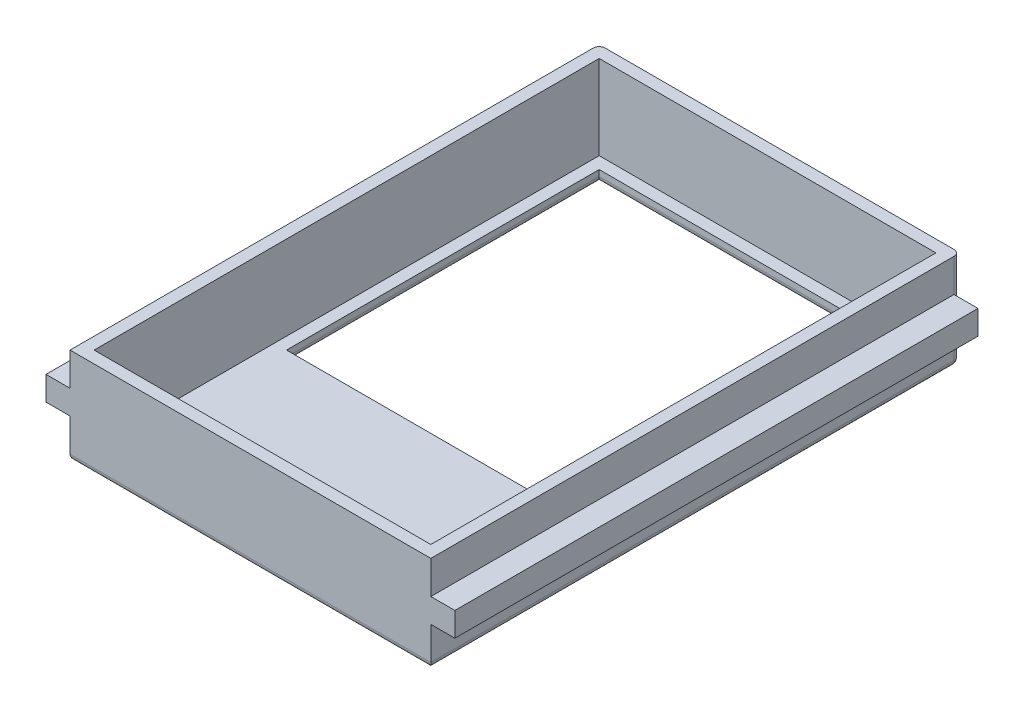
ISO-10303-21;
HEADER;
FILE_DESCRIPTION(('STEP AP214'),'2;1');
FILE_NAME('part.step','',(''),(''),'','','');
FILE_SCHEMA(('AUTOMOTIVE_DESIGN { 1 0 10303 214 1 1 1 1 }'));
ENDSEC;
DATA;
#1=APPLICATION_CONTEXT('core data for automotive mechanical design processes');
#2=APPLICATION_PROTOCOL_DEFINITION('international standard','automotive_design',2000,#1);
#3=PRODUCT_CONTEXT('',#1,'mechanical');
#4=PRODUCT('Part','Part','',(#3));
#5=PRODUCT_RELATED_PRODUCT_CATEGORY('part','',(#4));
#6=PRODUCT_DEFINITION_FORMATION('','',#4);
#7=PRODUCT_DEFINITION_CONTEXT('part definition',#1,'design');
#8=PRODUCT_DEFINITION('design','',#6,#7);
#9=PRODUCT_DEFINITION_SHAPE('','',#8);
#10=(LENGTH_UNIT() NAMED_UNIT(*) SI_UNIT(.MILLI.,.METRE.));
#11=(NAMED_UNIT(*) PLANE_ANGLE_UNIT() SI_UNIT($,.RADIAN.));
#12=(NAMED_UNIT(*) SI_UNIT($,.STERADIAN.) SOLID_ANGLE_UNIT());
#13=UNCERTAINTY_MEASURE_WITH_UNIT(LENGTH_MEASURE(1.E-05),#10,'distance_accuracy_value','');
#14=(GEOMETRIC_REPRESENTATION_CONTEXT(3) GLOBAL_UNCERTAINTY_ASSIGNED_CONTEXT((#13)) GLOBAL_UNIT_ASSIGNED_CONTEXT((#10,
#11,#12)) REPRESENTATION_CONTEXT('',''));
#15=CARTESIAN_POINT('',(0.,0.,0.));
#16=DIRECTION('',(0.,0.,1.));
#17=DIRECTION('',(1.,0.,0.));
#18=AXIS2_PLACEMENT_3D('',#15,#16,#17);
#19=CARTESIAN_POINT('',(30.,1.,0.));
#20=DIRECTION('',(-1.,0.,0.));
#21=DIRECTION('',(0.,0.,1.));
#22=AXIS2_PLACEMENT_3D('',#19,#20,#21);
#23=PLANE('',#22);
#24=DIRECTION('',(0.,0.,-1.));
#25=VECTOR('',#24,1.);
#26=CARTESIAN_POINT('',(30.,3.25,0.));
#27=LINE('',#26,#25);
#28=CARTESIAN_POINT('',(30.,3.25,0.));
#29=VERTEX_POINT('',#28);
#30=CARTESIAN_POINT('',(30.,3.25,-43.5));
#31=VERTEX_POINT('',#30);
#32=EDGE_CURVE('E58',#29,#31,#27,.T.);
#33=ORIENTED_EDGE('',*,*,#32,.F.);
#34=DIRECTION('',(0.,-1.,0.));
#35=VECTOR('',#34,1.);
#36=CARTESIAN_POINT('',(30.,1.,0.));
#37=LINE('',#36,#35);
#38=CARTESIAN_POINT('',(30.,0.5,0.));
#39=VERTEX_POINT('',#38);
#40=EDGE_CURVE('E241',#29,#39,#37,.T.);
#41=ORIENTED_EDGE('',*,*,#40,.T.);
#42=DIRECTION('',(0.,0.,-1.));
#43=VECTOR('',#42,1.);
#44=CARTESIAN_POINT('',(30.,0.5,-44.));
#45=LINE('',#44,#43);
#46=CARTESIAN_POINT('',(30.,0.5,-43.5));
#47=VERTEX_POINT('',#46);
#48=EDGE_CURVE('E376',#39,#47,#45,.T.);
#49=ORIENTED_EDGE('',*,*,#48,.T.);
#50=DIRECTION('',(0.,-1.,0.));
#51=VECTOR('',#50,1.);
#52=CARTESIAN_POINT('',(30.,1.,-43.5));
#53=LINE('',#52,#51);
#54=EDGE_CURVE('E374',#47,#31,#53,.F.);
#55=ORIENTED_EDGE('',*,*,#54,.T.);
#56=EDGE_LOOP('',(#33,#41,#49,#55));
#57=FACE_BOUND('',#56,.T.);
#58=ADVANCED_FACE('F41',(#57),#23,.F.);
#59=DIRECTION('',(0.,0.,1.));
#60=VECTOR('',#59,1.);
#61=CARTESIAN_POINT('',(30.,5.25,0.));
#62=LINE('',#61,#60);
#63=CARTESIAN_POINT('',(30.,5.25,-43.5));
#64=VERTEX_POINT('',#63);
#65=CARTESIAN_POINT('',(30.,5.25,0.));
#66=VERTEX_POINT('',#65);
#67=EDGE_CURVE('E236',#64,#66,#62,.T.);
#68=ORIENTED_EDGE('',*,*,#67,.F.);
#69=CARTESIAN_POINT('',(30.,8.,-43.5));
#70=VERTEX_POINT('',#69);
#71=EDGE_CURVE('E373',#64,#70,#53,.F.);
#72=ORIENTED_EDGE('',*,*,#71,.T.);
#73=DIRECTION('',(0.,0.,-1.));
#74=VECTOR('',#73,1.);
#75=CARTESIAN_POINT('',(30.,8.,-44.));
#76=LINE('',#75,#74);
#77=CARTESIAN_POINT('',(30.,8.,0.));
#78=VERTEX_POINT('',#77);
#79=EDGE_CURVE('E314',#78,#70,#76,.T.);
#80=ORIENTED_EDGE('',*,*,#79,.F.);
#81=EDGE_CURVE('E66',#78,#66,#37,.T.);
#82=ORIENTED_EDGE('',*,*,#81,.T.);
#83=EDGE_LOOP('',(#68,#72,#80,#82));
#84=FACE_BOUND('',#83,.T.);
#85=ADVANCED_FACE('F485',(#84),#23,.F.);
#86=CARTESIAN_POINT('',(0.,1.,0.));
#87=DIRECTION('',(1.,0.,0.));
#88=DIRECTION('',(0.,0.,-1.));
#89=AXIS2_PLACEMENT_3D('',#86,#87,#88);
#90=PLANE('',#89);
#91=DIRECTION('',(0.,0.,1.));
#92=VECTOR('',#91,1.);
#93=CARTESIAN_POINT('',(0.,3.25,-43.5));
#94=LINE('',#93,#92);
#95=CARTESIAN_POINT('',(0.,3.25,-43.5));
#96=VERTEX_POINT('',#95);
#97=CARTESIAN_POINT('',(0.,3.25,0.));
#98=VERTEX_POINT('',#97);
#99=EDGE_CURVE('E245',#96,#98,#94,.T.);
#100=ORIENTED_EDGE('',*,*,#99,.F.);
#101=DIRECTION('',(0.,-1.,0.));
#102=VECTOR('',#101,1.);
#103=CARTESIAN_POINT('',(0.,1.,-43.5));
#104=LINE('',#103,#102);
#105=CARTESIAN_POINT('',(0.,0.5,-43.5));
#106=VERTEX_POINT('',#105);
#107=EDGE_CURVE('E384',#96,#106,#104,.T.);
#108=ORIENTED_EDGE('',*,*,#107,.T.);
#109=DIRECTION('',(0.,0.,1.));
#110=VECTOR('',#109,1.);
#111=CARTESIAN_POINT('',(0.,0.5,0.));
#112=LINE('',#111,#110);
#113=CARTESIAN_POINT('',(0.,0.5,0.));
#114=VERTEX_POINT('',#113);
#115=EDGE_CURVE('E388',#106,#114,#112,.T.);
#116=ORIENTED_EDGE('',*,*,#115,.T.);
#117=DIRECTION('',(0.,-1.,0.));
#118=VECTOR('',#117,1.);
#119=CARTESIAN_POINT('',(0.,1.,0.));
#120=LINE('',#119,#118);
#121=EDGE_CURVE('E341',#98,#114,#120,.T.);
#122=ORIENTED_EDGE('',*,*,#121,.F.);
#123=EDGE_LOOP('',(#100,#108,#116,#122));
#124=FACE_BOUND('',#123,.T.);
#125=ADVANCED_FACE('F435',(#124),#90,.F.);
#126=DIRECTION('',(0.,0.,-1.));
#127=VECTOR('',#126,1.);
#128=CARTESIAN_POINT('',(0.,5.25,-43.5));
#129=LINE('',#128,#127);
#130=CARTESIAN_POINT('',(0.,5.25,0.));
#131=VERTEX_POINT('',#130);
#132=CARTESIAN_POINT('',(0.,5.25,-43.5));
#133=VERTEX_POINT('',#132);
#134=EDGE_CURVE('E255',#131,#133,#129,.T.);
#135=ORIENTED_EDGE('',*,*,#134,.F.);
#136=CARTESIAN_POINT('',(0.,8.,0.));
#137=VERTEX_POINT('',#136);
#138=EDGE_CURVE('E342',#137,#131,#120,.T.);
#139=ORIENTED_EDGE('',*,*,#138,.F.);
#140=DIRECTION('',(0.,0.,1.));
#141=VECTOR('',#140,1.);
#142=CARTESIAN_POINT('',(0.,8.,-44.));
#143=LINE('',#142,#141);
#144=CARTESIAN_POINT('',(0.,8.,-43.5));
#145=VERTEX_POINT('',#144);
#146=EDGE_CURVE('E309',#145,#137,#143,.T.);
#147=ORIENTED_EDGE('',*,*,#146,.F.);
#148=EDGE_CURVE('E385',#145,#133,#104,.T.);
#149=ORIENTED_EDGE('',*,*,#148,.T.);
#150=EDGE_LOOP('',(#135,#139,#147,#149));
#151=FACE_BOUND('',#150,.T.);
#152=ADVANCED_FACE('F479',(#151),#90,.F.);
#153=CARTESIAN_POINT('',(0.,1.,0.));
#154=DIRECTION('',(0.,0.,-1.));
#155=DIRECTION('',(-1.,0.,0.));
#156=AXIS2_PLACEMENT_3D('',#153,#154,#155);
#157=PLANE('',#156);
#158=ORIENTED_EDGE('',*,*,#138,.T.);
#159=DIRECTION('',(1.,0.,0.));
#160=VECTOR('',#159,1.);
#161=CARTESIAN_POINT('',(-2.,5.25,0.));
#162=LINE('',#161,#160);
#163=CARTESIAN_POINT('',(-2.,5.25,0.));
#164=VERTEX_POINT('',#163);
#165=EDGE_CURVE('E268',#164,#131,#162,.T.);
#166=ORIENTED_EDGE('',*,*,#165,.F.);
#167=DIRECTION('',(0.,1.,0.));
#168=VECTOR('',#167,1.);
#169=CARTESIAN_POINT('',(-2.,3.25,0.));
#170=LINE('',#169,#168);
#171=CARTESIAN_POINT('',(-2.,3.25,0.));
#172=VERTEX_POINT('',#171);
#173=EDGE_CURVE('E257',#172,#164,#170,.T.);
#174=ORIENTED_EDGE('',*,*,#173,.F.);
#175=DIRECTION('',(1.,0.,0.));
#176=VECTOR('',#175,1.);
#177=CARTESIAN_POINT('',(-2.,3.25,0.));
#178=LINE('',#177,#176);
#179=EDGE_CURVE('E271',#172,#98,#178,.T.);
#180=ORIENTED_EDGE('',*,*,#179,.T.);
#181=ORIENTED_EDGE('',*,*,#121,.T.);
#182=DIRECTION('',(1.,0.,0.));
#183=VECTOR('',#182,1.);
#184=CARTESIAN_POINT('',(30.,0.5,0.));
#185=LINE('',#184,#183);
#186=EDGE_CURVE('E371',#114,#39,#185,.T.);
#187=ORIENTED_EDGE('',*,*,#186,.T.);
#188=ORIENTED_EDGE('',*,*,#40,.F.);
#189=DIRECTION('',(-1.,0.,0.));
#190=VECTOR('',#189,1.);
#191=CARTESIAN_POINT('',(32.,3.25,0.));
#192=LINE('',#191,#190);
#193=CARTESIAN_POINT('',(32.,3.25,0.));
#194=VERTEX_POINT('',#193);
#195=EDGE_CURVE('E221',#194,#29,#192,.T.);
#196=ORIENTED_EDGE('',*,*,#195,.F.);
#197=DIRECTION('',(0.,-1.,0.));
#198=VECTOR('',#197,1.);
#199=CARTESIAN_POINT('',(32.,5.25,0.));
#200=LINE('',#199,#198);
#201=CARTESIAN_POINT('',(32.,5.25,0.));
#202=VERTEX_POINT('',#201);
#203=EDGE_CURVE('E227',#202,#194,#200,.T.);
#204=ORIENTED_EDGE('',*,*,#203,.F.);
#205=DIRECTION('',(-1.,0.,0.));
#206=VECTOR('',#205,1.);
#207=CARTESIAN_POINT('',(32.,5.25,0.));
#208=LINE('',#207,#206);
#209=EDGE_CURVE('E496',#202,#66,#208,.T.);
#210=ORIENTED_EDGE('',*,*,#209,.T.);
#211=ORIENTED_EDGE('',*,*,#81,.F.);
#212=DIRECTION('',(1.,0.,0.));
#213=VECTOR('',#212,1.);
#214=CARTESIAN_POINT('',(0.,8.,0.));
#215=LINE('',#214,#213);
#216=EDGE_CURVE('E311',#137,#78,#215,.T.);
#217=ORIENTED_EDGE('',*,*,#216,.F.);
#218=EDGE_LOOP('',(#158,#166,#174,#180,#181,#187,#188,#196,#204,#210,#211,#217));
#219=FACE_BOUND('',#218,.T.);
#220=ADVANCED_FACE('F239',(#219),#157,.F.);
#221=CARTESIAN_POINT('',(0.,1.,-44.));
#222=DIRECTION('',(0.,0.,1.));
#223=DIRECTION('',(1.,0.,0.));
#224=AXIS2_PLACEMENT_3D('',#221,#222,#223);
#225=PLANE('',#224);
#226=DIRECTION('',(-1.,0.,0.));
#227=VECTOR('',#226,1.);
#228=CARTESIAN_POINT('',(0.,8.,-44.));
#229=LINE('',#228,#227);
#230=CARTESIAN_POINT('',(29.5,8.,-44.));
#231=VERTEX_POINT('',#230);
#232=CARTESIAN_POINT('',(0.5,8.,-44.));
#233=VERTEX_POINT('',#232);
#234=EDGE_CURVE('E317',#231,#233,#229,.T.);
#235=ORIENTED_EDGE('',*,*,#234,.F.);
#236=DIRECTION('',(0.,-1.,0.));
#237=VECTOR('',#236,1.);
#238=CARTESIAN_POINT('',(29.5,1.,-44.));
#239=LINE('',#238,#237);
#240=CARTESIAN_POINT('',(29.5,0.5,-44.));
#241=VERTEX_POINT('',#240);
#242=EDGE_CURVE('E382',#231,#241,#239,.T.);
#243=ORIENTED_EDGE('',*,*,#242,.T.);
#244=DIRECTION('',(-1.,0.,0.));
#245=VECTOR('',#244,1.);
#246=CARTESIAN_POINT('',(0.,0.5,-44.));
#247=LINE('',#246,#245);
#248=CARTESIAN_POINT('',(0.5,0.5,-44.));
#249=VERTEX_POINT('',#248);
#250=EDGE_CURVE('E380',#241,#249,#247,.T.);
#251=ORIENTED_EDGE('',*,*,#250,.T.);
#252=DIRECTION('',(0.,-1.,0.));
#253=VECTOR('',#252,1.);
#254=CARTESIAN_POINT('',(0.5,1.,-44.));
#255=LINE('',#254,#253);
#256=EDGE_CURVE('E378',#249,#233,#255,.F.);
#257=ORIENTED_EDGE('',*,*,#256,.T.);
#258=EDGE_LOOP('',(#235,#243,#251,#257));
#259=FACE_BOUND('',#258,.T.);
#260=ADVANCED_FACE('F442',(#259),#225,.F.);
#261=CARTESIAN_POINT('',(0.,1.,0.));
#262=DIRECTION('',(0.,-1.,0.));
#263=DIRECTION('',(0.,0.,-1.));
#264=AXIS2_PLACEMENT_3D('',#261,#262,#263);
#265=PLANE('',#264);
#266=DIRECTION('',(-1.,0.,0.));
#267=VECTOR('',#266,1.);
#268=CARTESIAN_POINT('',(1.,1.,-43.));
#269=LINE('',#268,#267);
#270=CARTESIAN_POINT('',(29.,1.,-43.));
#271=VERTEX_POINT('',#270);
#272=CARTESIAN_POINT('',(1.,1.,-43.));
#273=VERTEX_POINT('',#272);
#274=EDGE_CURVE('E281',#271,#273,#269,.T.);
#275=ORIENTED_EDGE('',*,*,#274,.T.);
#276=DIRECTION('',(0.,0.,1.));
#277=VECTOR('',#276,1.);
#278=CARTESIAN_POINT('',(1.,1.,-43.));
#279=LINE('',#278,#277);
#280=CARTESIAN_POINT('',(1.00000000000001,1.,-1.));
#281=VERTEX_POINT('',#280);
#282=EDGE_CURVE('E289',#273,#281,#279,.T.);
#283=ORIENTED_EDGE('',*,*,#282,.T.);
#284=DIRECTION('',(1.,0.,0.));
#285=VECTOR('',#284,1.);
#286=CARTESIAN_POINT('',(1.00000000000001,1.,-1.));
#287=LINE('',#286,#285);
#288=CARTESIAN_POINT('',(29.,1.,-1.));
#289=VERTEX_POINT('',#288);
#290=EDGE_CURVE('E292',#281,#289,#287,.T.);
#291=ORIENTED_EDGE('',*,*,#290,.T.);
#292=DIRECTION('',(0.,0.,-1.));
#293=VECTOR('',#292,1.);
#294=CARTESIAN_POINT('',(29.,1.,-43.));
#295=LINE('',#294,#293);
#296=EDGE_CURVE('E296',#289,#271,#295,.T.);
#297=ORIENTED_EDGE('',*,*,#296,.T.);
#298=EDGE_LOOP('',(#275,#283,#291,#297));
#299=FACE_BOUND('',#298,.T.);
#300=DIRECTION('',(1.,0.,0.));
#301=VECTOR('',#300,1.);
#302=CARTESIAN_POINT('',(2.,1.,-16.));
#303=LINE('',#302,#301);
#304=CARTESIAN_POINT('',(2.,1.,-16.));
#305=VERTEX_POINT('',#304);
#306=CARTESIAN_POINT('',(28.,1.,-16.));
#307=VERTEX_POINT('',#306);
#308=EDGE_CURVE('E323',#305,#307,#303,.T.);
#309=ORIENTED_EDGE('',*,*,#308,.F.);
#310=DIRECTION('',(0.,0.,1.));
#311=VECTOR('',#310,1.);
#312=CARTESIAN_POINT('',(2.,1.,-42.));
#313=LINE('',#312,#311);
#314=CARTESIAN_POINT('',(2.,1.,-42.));
#315=VERTEX_POINT('',#314);
#316=EDGE_CURVE('E320',#315,#305,#313,.T.);
#317=ORIENTED_EDGE('',*,*,#316,.F.);
#318=DIRECTION('',(-1.,0.,0.));
#319=VECTOR('',#318,1.);
#320=CARTESIAN_POINT('',(2.,1.,-42.));
#321=LINE('',#320,#319);
#322=CARTESIAN_POINT('',(28.,1.,-42.));
#323=VERTEX_POINT('',#322);
#324=EDGE_CURVE('E329',#323,#315,#321,.T.);
#325=ORIENTED_EDGE('',*,*,#324,.F.);
#326=DIRECTION('',(0.,0.,-1.));
#327=VECTOR('',#326,1.);
#328=CARTESIAN_POINT('',(28.,1.,-42.));
#329=LINE('',#328,#327);
#330=EDGE_CURVE('E326',#307,#323,#329,.T.);
#331=ORIENTED_EDGE('',*,*,#330,.F.);
#332=EDGE_LOOP('',(#309,#317,#325,#331));
#333=FACE_BOUND('',#332,.T.);
#334=ADVANCED_FACE('F651',(#299,#333),#265,.F.);
#335=CARTESIAN_POINT('',(0.,0.,0.));
#336=DIRECTION('',(0.,-1.,0.));
#337=DIRECTION('',(0.,0.,-1.));
#338=AXIS2_PLACEMENT_3D('',#335,#336,#337);
#339=PLANE('',#338);
#340=DIRECTION('',(0.,0.,-1.));
#341=VECTOR('',#340,1.);
#342=CARTESIAN_POINT('',(28.5,0.,-42.));
#343=LINE('',#342,#341);
#344=CARTESIAN_POINT('',(28.5,0.,-15.5));
#345=VERTEX_POINT('',#344);
#346=CARTESIAN_POINT('',(28.5,0.,-42.5));
#347=VERTEX_POINT('',#346);
#348=EDGE_CURVE('E357',#345,#347,#343,.T.);
#349=ORIENTED_EDGE('',*,*,#348,.T.);
#350=DIRECTION('',(-1.,0.,0.));
#351=VECTOR('',#350,1.);
#352=CARTESIAN_POINT('',(2.,0.,-42.5));
#353=LINE('',#352,#351);
#354=CARTESIAN_POINT('',(1.5,0.,-42.5));
#355=VERTEX_POINT('',#354);
#356=EDGE_CURVE('E359',#347,#355,#353,.T.);
#357=ORIENTED_EDGE('',*,*,#356,.T.);
#358=DIRECTION('',(0.,0.,1.));
#359=VECTOR('',#358,1.);
#360=CARTESIAN_POINT('',(1.5,0.,-16.));
#361=LINE('',#360,#359);
#362=CARTESIAN_POINT('',(1.5,0.,-15.5));
#363=VERTEX_POINT('',#362);
#364=EDGE_CURVE('E353',#355,#363,#361,.T.);
#365=ORIENTED_EDGE('',*,*,#364,.T.);
#366=DIRECTION('',(1.,0.,0.));
#367=VECTOR('',#366,1.);
#368=CARTESIAN_POINT('',(28.,0.,-15.5));
#369=LINE('',#368,#367);
#370=EDGE_CURVE('E355',#363,#345,#369,.T.);
#371=ORIENTED_EDGE('',*,*,#370,.T.);
#372=EDGE_LOOP('',(#349,#357,#365,#371));
#373=FACE_BOUND('',#372,.T.);
#374=DIRECTION('',(0.,0.,-1.));
#375=VECTOR('',#374,1.);
#376=CARTESIAN_POINT('',(29.5,0.,0.));
#377=LINE('',#376,#375);
#378=CARTESIAN_POINT('',(29.5,0.,-43.5));
#379=VERTEX_POINT('',#378);
#380=CARTESIAN_POINT('',(29.5,0.,-0.5));
#381=VERTEX_POINT('',#380);
#382=EDGE_CURVE('E348',#379,#381,#377,.F.);
#383=ORIENTED_EDGE('',*,*,#382,.T.);
#384=DIRECTION('',(1.,0.,0.));
#385=VECTOR('',#384,1.);
#386=CARTESIAN_POINT('',(0.,0.,-0.5));
#387=LINE('',#386,#385);
#388=CARTESIAN_POINT('',(0.5,0.,-0.5));
#389=VERTEX_POINT('',#388);
#390=EDGE_CURVE('E350',#381,#389,#387,.F.);
#391=ORIENTED_EDGE('',*,*,#390,.T.);
#392=DIRECTION('',(0.,0.,1.));
#393=VECTOR('',#392,1.);
#394=CARTESIAN_POINT('',(0.5,0.,-44.));
#395=LINE('',#394,#393);
#396=CARTESIAN_POINT('',(0.5,0.,-43.5));
#397=VERTEX_POINT('',#396);
#398=EDGE_CURVE('E344',#389,#397,#395,.F.);
#399=ORIENTED_EDGE('',*,*,#398,.T.);
#400=DIRECTION('',(-1.,0.,0.));
#401=VECTOR('',#400,1.);
#402=CARTESIAN_POINT('',(30.,0.,-43.5));
#403=LINE('',#402,#401);
#404=EDGE_CURVE('E346',#397,#379,#403,.F.);
#405=ORIENTED_EDGE('',*,*,#404,.T.);
#406=EDGE_LOOP('',(#383,#391,#399,#405));
#407=FACE_BOUND('',#406,.T.);
#408=ADVANCED_FACE('F465',(#373,#407),#339,.T.);
#409=CARTESIAN_POINT('',(2.,0.,-42.));
#410=DIRECTION('',(-1.,0.,0.));
#411=DIRECTION('',(0.,0.,1.));
#412=AXIS2_PLACEMENT_3D('',#409,#410,#411);
#413=PLANE('',#412);
#414=DIRECTION('',(0.,1.,0.));
#415=VECTOR('',#414,1.);
#416=CARTESIAN_POINT('',(2.,0.,-16.));
#417=LINE('',#416,#415);
#418=CARTESIAN_POINT('',(2.,0.5,-16.));
#419=VERTEX_POINT('',#418);
#420=EDGE_CURVE('E332',#419,#305,#417,.T.);
#421=ORIENTED_EDGE('',*,*,#420,.F.);
#422=DIRECTION('',(0.,0.,1.));
#423=VECTOR('',#422,1.);
#424=CARTESIAN_POINT('',(2.,0.5,-42.));
#425=LINE('',#424,#423);
#426=CARTESIAN_POINT('',(2.,0.5,-42.));
#427=VERTEX_POINT('',#426);
#428=EDGE_CURVE('E369',#419,#427,#425,.F.);
#429=ORIENTED_EDGE('',*,*,#428,.T.);
#430=DIRECTION('',(0.,1.,0.));
#431=VECTOR('',#430,1.);
#432=CARTESIAN_POINT('',(2.,0.,-42.));
#433=LINE('',#432,#431);
#434=EDGE_CURVE('E333',#427,#315,#433,.T.);
#435=ORIENTED_EDGE('',*,*,#434,.T.);
#436=ORIENTED_EDGE('',*,*,#316,.T.);
#437=EDGE_LOOP('',(#421,#429,#435,#436));
#438=FACE_BOUND('',#437,.T.);
#439=ADVANCED_FACE('F636',(#438),#413,.F.);
#440=CARTESIAN_POINT('',(2.,0.,-42.));
#441=DIRECTION('',(0.,0.,-1.));
#442=DIRECTION('',(-1.,0.,0.));
#443=AXIS2_PLACEMENT_3D('',#440,#441,#442);
#444=PLANE('',#443);
#445=ORIENTED_EDGE('',*,*,#434,.F.);
#446=DIRECTION('',(-1.,0.,0.));
#447=VECTOR('',#446,1.);
#448=CARTESIAN_POINT('',(28.,0.5,-42.));
#449=LINE('',#448,#447);
#450=CARTESIAN_POINT('',(28.,0.5,-42.));
#451=VERTEX_POINT('',#450);
#452=EDGE_CURVE('E362',#427,#451,#449,.F.);
#453=ORIENTED_EDGE('',*,*,#452,.T.);
#454=DIRECTION('',(0.,1.,0.));
#455=VECTOR('',#454,1.);
#456=CARTESIAN_POINT('',(28.,0.,-42.));
#457=LINE('',#456,#455);
#458=EDGE_CURVE('E335',#451,#323,#457,.T.);
#459=ORIENTED_EDGE('',*,*,#458,.T.);
#460=ORIENTED_EDGE('',*,*,#324,.T.);
#461=EDGE_LOOP('',(#445,#453,#459,#460));
#462=FACE_BOUND('',#461,.T.);
#463=ADVANCED_FACE('F628',(#462),#444,.F.);
#464=CARTESIAN_POINT('',(28.,0.,-42.));
#465=DIRECTION('',(1.,0.,0.));
#466=DIRECTION('',(0.,0.,-1.));
#467=AXIS2_PLACEMENT_3D('',#464,#465,#466);
#468=PLANE('',#467);
#469=ORIENTED_EDGE('',*,*,#458,.F.);
#470=DIRECTION('',(0.,0.,-1.));
#471=VECTOR('',#470,1.);
#472=CARTESIAN_POINT('',(28.,0.5,-16.));
#473=LINE('',#472,#471);
#474=CARTESIAN_POINT('',(28.,0.5,-16.));
#475=VERTEX_POINT('',#474);
#476=EDGE_CURVE('E365',#451,#475,#473,.F.);
#477=ORIENTED_EDGE('',*,*,#476,.T.);
#478=DIRECTION('',(0.,1.,0.));
#479=VECTOR('',#478,1.);
#480=CARTESIAN_POINT('',(28.,0.,-16.));
#481=LINE('',#480,#479);
#482=EDGE_CURVE('E337',#475,#307,#481,.T.);
#483=ORIENTED_EDGE('',*,*,#482,.T.);
#484=ORIENTED_EDGE('',*,*,#330,.T.);
#485=EDGE_LOOP('',(#469,#477,#483,#484));
#486=FACE_BOUND('',#485,.T.);
#487=ADVANCED_FACE('F620',(#486),#468,.F.);
#488=CARTESIAN_POINT('',(2.,0.,-16.));
#489=DIRECTION('',(0.,0.,1.));
#490=DIRECTION('',(1.,0.,0.));
#491=AXIS2_PLACEMENT_3D('',#488,#489,#490);
#492=PLANE('',#491);
#493=ORIENTED_EDGE('',*,*,#482,.F.);
#494=DIRECTION('',(1.,0.,0.));
#495=VECTOR('',#494,1.);
#496=CARTESIAN_POINT('',(2.,0.5,-16.));
#497=LINE('',#496,#495);
#498=EDGE_CURVE('E367',#475,#419,#497,.F.);
#499=ORIENTED_EDGE('',*,*,#498,.T.);
#500=ORIENTED_EDGE('',*,*,#420,.T.);
#501=ORIENTED_EDGE('',*,*,#308,.T.);
#502=EDGE_LOOP('',(#493,#499,#500,#501));
#503=FACE_BOUND('',#502,.T.);
#504=ADVANCED_FACE('F613',(#503),#492,.F.);
#505=CARTESIAN_POINT('',(0.,8.,0.));
#506=DIRECTION('',(0.,1.,0.));
#507=DIRECTION('',(0.,0.,1.));
#508=AXIS2_PLACEMENT_3D('',#505,#506,#507);
#509=PLANE('',#508);
#510=ORIENTED_EDGE('',*,*,#79,.T.);
#511=CARTESIAN_POINT('',(29.5,8.,-43.5));
#512=DIRECTION('',(0.,1.,0.));
#513=DIRECTION('',(0.,0.,1.));
#514=AXIS2_PLACEMENT_3D('',#511,#512,#513);
#515=CIRCLE('',#514,0.5);
#516=EDGE_CURVE('E11',#70,#231,#515,.T.);
#517=ORIENTED_EDGE('',*,*,#516,.T.);
#518=ORIENTED_EDGE('',*,*,#234,.T.);
#519=CARTESIAN_POINT('',(0.5,8.,-43.5));
#520=DIRECTION('',(0.,1.,0.));
#521=DIRECTION('',(0.,0.,1.));
#522=AXIS2_PLACEMENT_3D('',#519,#520,#521);
#523=CIRCLE('',#522,0.5);
#524=EDGE_CURVE('E50',#233,#145,#523,.T.);
#525=ORIENTED_EDGE('',*,*,#524,.T.);
#526=ORIENTED_EDGE('',*,*,#146,.T.);
#527=ORIENTED_EDGE('',*,*,#216,.T.);
#528=EDGE_LOOP('',(#510,#517,#518,#525,#526,#527));
#529=FACE_BOUND('',#528,.T.);
#530=DIRECTION('',(1.,0.,0.));
#531=VECTOR('',#530,1.);
#532=CARTESIAN_POINT('',(1.00000000000001,8.,-1.));
#533=LINE('',#532,#531);
#534=CARTESIAN_POINT('',(1.00000000000001,8.,-1.));
#535=VERTEX_POINT('',#534);
#536=CARTESIAN_POINT('',(29.,8.,-1.));
#537=VERTEX_POINT('',#536);
#538=EDGE_CURVE('E280',#535,#537,#533,.T.);
#539=ORIENTED_EDGE('',*,*,#538,.F.);
#540=DIRECTION('',(0.,0.,1.));
#541=VECTOR('',#540,1.);
#542=CARTESIAN_POINT('',(1.,8.,-43.));
#543=LINE('',#542,#541);
#544=CARTESIAN_POINT('',(1.,8.,-43.));
#545=VERTEX_POINT('',#544);
#546=EDGE_CURVE('E278',#545,#535,#543,.T.);
#547=ORIENTED_EDGE('',*,*,#546,.F.);
#548=DIRECTION('',(-1.,0.,0.));
#549=VECTOR('',#548,1.);
#550=CARTESIAN_POINT('',(1.,8.,-43.));
#551=LINE('',#550,#549);
#552=CARTESIAN_POINT('',(29.,8.,-43.));
#553=VERTEX_POINT('',#552);
#554=EDGE_CURVE('E286',#553,#545,#551,.T.);
#555=ORIENTED_EDGE('',*,*,#554,.F.);
#556=DIRECTION('',(0.,0.,-1.));
#557=VECTOR('',#556,1.);
#558=CARTESIAN_POINT('',(29.,8.,-43.));
#559=LINE('',#558,#557);
#560=EDGE_CURVE('E283',#537,#553,#559,.T.);
#561=ORIENTED_EDGE('',*,*,#560,.F.);
#562=EDGE_LOOP('',(#539,#547,#555,#561));
#563=FACE_BOUND('',#562,.T.);
#564=ADVANCED_FACE('F445',(#529,#563),#509,.T.);
#565=CARTESIAN_POINT('',(1.,8.,-43.));
#566=DIRECTION('',(1.,0.,0.));
#567=DIRECTION('',(0.,0.,-1.));
#568=AXIS2_PLACEMENT_3D('',#565,#566,#567);
#569=PLANE('',#568);
#570=ORIENTED_EDGE('',*,*,#282,.F.);
#571=DIRECTION('',(0.,-1.,0.));
#572=VECTOR('',#571,1.);
#573=CARTESIAN_POINT('',(1.,8.,-43.));
#574=LINE('',#573,#572);
#575=EDGE_CURVE('E288',#545,#273,#574,.T.);
#576=ORIENTED_EDGE('',*,*,#575,.F.);
#577=ORIENTED_EDGE('',*,*,#546,.T.);
#578=DIRECTION('',(0.,-1.,0.));
#579=VECTOR('',#578,1.);
#580=CARTESIAN_POINT('',(1.00000000000001,8.,-1.));
#581=LINE('',#580,#579);
#582=EDGE_CURVE('E306',#535,#281,#581,.T.);
#583=ORIENTED_EDGE('',*,*,#582,.T.);
#584=EDGE_LOOP('',(#570,#576,#577,#583));
#585=FACE_BOUND('',#584,.T.);
#586=ADVANCED_FACE('F598',(#585),#569,.T.);
#587=CARTESIAN_POINT('',(1.00000000000001,8.,-1.));
#588=DIRECTION('',(0.,0.,-1.));
#589=DIRECTION('',(-1.,0.,0.));
#590=AXIS2_PLACEMENT_3D('',#587,#588,#589);
#591=PLANE('',#590);
#592=ORIENTED_EDGE('',*,*,#290,.F.);
#593=ORIENTED_EDGE('',*,*,#582,.F.);
#594=ORIENTED_EDGE('',*,*,#538,.T.);
#595=DIRECTION('',(0.,-1.,0.));
#596=VECTOR('',#595,1.);
#597=CARTESIAN_POINT('',(29.,8.,-1.));
#598=LINE('',#597,#596);
#599=EDGE_CURVE('E304',#537,#289,#598,.T.);
#600=ORIENTED_EDGE('',*,*,#599,.T.);
#601=EDGE_LOOP('',(#592,#593,#594,#600));
#602=FACE_BOUND('',#601,.T.);
#603=ADVANCED_FACE('F590',(#602),#591,.T.);
#604=CARTESIAN_POINT('',(29.,8.,-43.));
#605=DIRECTION('',(-1.,0.,0.));
#606=DIRECTION('',(0.,0.,1.));
#607=AXIS2_PLACEMENT_3D('',#604,#605,#606);
#608=PLANE('',#607);
#609=ORIENTED_EDGE('',*,*,#296,.F.);
#610=ORIENTED_EDGE('',*,*,#599,.F.);
#611=ORIENTED_EDGE('',*,*,#560,.T.);
#612=DIRECTION('',(0.,-1.,0.));
#613=VECTOR('',#612,1.);
#614=CARTESIAN_POINT('',(29.,8.,-43.));
#615=LINE('',#614,#613);
#616=EDGE_CURVE('E302',#553,#271,#615,.T.);
#617=ORIENTED_EDGE('',*,*,#616,.T.);
#618=EDGE_LOOP('',(#609,#610,#611,#617));
#619=FACE_BOUND('',#618,.T.);
#620=ADVANCED_FACE('F581',(#619),#608,.T.);
#621=CARTESIAN_POINT('',(1.,8.,-43.));
#622=DIRECTION('',(0.,0.,1.));
#623=DIRECTION('',(1.,0.,0.));
#624=AXIS2_PLACEMENT_3D('',#621,#622,#623);
#625=PLANE('',#624);
#626=ORIENTED_EDGE('',*,*,#274,.F.);
#627=ORIENTED_EDGE('',*,*,#616,.F.);
#628=ORIENTED_EDGE('',*,*,#554,.T.);
#629=ORIENTED_EDGE('',*,*,#575,.T.);
#630=EDGE_LOOP('',(#626,#627,#628,#629));
#631=FACE_BOUND('',#630,.T.);
#632=ADVANCED_FACE('F536',(#631),#625,.T.);
#633=CARTESIAN_POINT('',(0.,0.5,-15.5));
#634=DIRECTION('',(-1.,0.,0.));
#635=DIRECTION('',(0.,0.,1.));
#636=AXIS2_PLACEMENT_3D('',#633,#634,#635);
#637=CYLINDRICAL_SURFACE('',#636,0.5);
#638=CARTESIAN_POINT('',(1.5,0.5,-15.5));
#639=DIRECTION('',(-0.707106781186547,0.,-0.707106781186547));
#640=DIRECTION('',(-0.707106781186547,0.,0.707106781186548));
#641=AXIS2_PLACEMENT_3D('',#638,#639,#640);
#642=ELLIPSE('',#641,0.707106781186547,0.5);
#643=EDGE_CURVE('E396',#419,#363,#642,.T.);
#644=ORIENTED_EDGE('',*,*,#643,.F.);
#645=ORIENTED_EDGE('',*,*,#498,.F.);
#646=CARTESIAN_POINT('',(28.5,0.5,-15.5));
#647=DIRECTION('',(-0.707106781186547,0.,0.707106781186548));
#648=DIRECTION('',(0.707106781186548,0.,0.707106781186547));
#649=AXIS2_PLACEMENT_3D('',#646,#647,#648);
#650=ELLIPSE('',#649,0.707106781186548,0.5);
#651=EDGE_CURVE('E293',#345,#475,#650,.F.);
#652=ORIENTED_EDGE('',*,*,#651,.F.);
#653=ORIENTED_EDGE('',*,*,#370,.F.);
#654=EDGE_LOOP('',(#644,#645,#652,#653));
#655=FACE_BOUND('',#654,.T.);
#656=ADVANCED_FACE('F532',(#655),#637,.T.);
#657=CARTESIAN_POINT('',(28.5,0.5,0.));
#658=DIRECTION('',(0.,0.,1.));
#659=DIRECTION('',(1.,0.,0.));
#660=AXIS2_PLACEMENT_3D('',#657,#658,#659);
#661=CYLINDRICAL_SURFACE('',#660,0.5);
#662=ORIENTED_EDGE('',*,*,#651,.T.);
#663=ORIENTED_EDGE('',*,*,#476,.F.);
#664=CARTESIAN_POINT('',(28.5,0.5,-42.5));
#665=DIRECTION('',(0.707106781186548,0.,0.707106781186547));
#666=DIRECTION('',(0.707106781186547,0.,-0.707106781186548));
#667=AXIS2_PLACEMENT_3D('',#664,#665,#666);
#668=ELLIPSE('',#667,0.707106781186547,0.5);
#669=EDGE_CURVE('E394',#347,#451,#668,.F.);
#670=ORIENTED_EDGE('',*,*,#669,.F.);
#671=ORIENTED_EDGE('',*,*,#348,.F.);
#672=EDGE_LOOP('',(#662,#663,#670,#671));
#673=FACE_BOUND('',#672,.T.);
#674=ADVANCED_FACE('F528',(#673),#661,.T.);
#675=CARTESIAN_POINT('',(1.5,0.5,0.));
#676=DIRECTION('',(0.,0.,-1.));
#677=DIRECTION('',(-1.,0.,0.));
#678=AXIS2_PLACEMENT_3D('',#675,#676,#677);
#679=CYLINDRICAL_SURFACE('',#678,0.5);
#680=ORIENTED_EDGE('',*,*,#643,.T.);
#681=ORIENTED_EDGE('',*,*,#364,.F.);
#682=CARTESIAN_POINT('',(1.5,0.5,-42.5));
#683=DIRECTION('',(0.707106781186547,0.,-0.707106781186548));
#684=DIRECTION('',(0.707106781186547,0.,0.707106781186547));
#685=AXIS2_PLACEMENT_3D('',#682,#683,#684);
#686=ELLIPSE('',#685,0.707106781186548,0.5);
#687=EDGE_CURVE('E392',#427,#355,#686,.T.);
#688=ORIENTED_EDGE('',*,*,#687,.F.);
#689=ORIENTED_EDGE('',*,*,#428,.F.);
#690=EDGE_LOOP('',(#680,#681,#688,#689));
#691=FACE_BOUND('',#690,.T.);
#692=ADVANCED_FACE('F524',(#691),#679,.T.);
#693=CARTESIAN_POINT('',(0.,0.5,-42.5));
#694=DIRECTION('',(1.,0.,0.));
#695=DIRECTION('',(0.,0.,-1.));
#696=AXIS2_PLACEMENT_3D('',#693,#694,#695);
#697=CYLINDRICAL_SURFACE('',#696,0.5);
#698=ORIENTED_EDGE('',*,*,#669,.T.);
#699=ORIENTED_EDGE('',*,*,#452,.F.);
#700=ORIENTED_EDGE('',*,*,#687,.T.);
#701=ORIENTED_EDGE('',*,*,#356,.F.);
#702=EDGE_LOOP('',(#698,#699,#700,#701));
#703=FACE_BOUND('',#702,.T.);
#704=ADVANCED_FACE('F521',(#703),#697,.T.);
#705=CARTESIAN_POINT('',(0.5,1.,-43.5));
#706=DIRECTION('',(0.,-1.,0.));
#707=DIRECTION('',(0.,0.,-1.));
#708=AXIS2_PLACEMENT_3D('',#705,#706,#707);
#709=CYLINDRICAL_SURFACE('',#708,0.5);
#710=ORIENTED_EDGE('',*,*,#524,.F.);
#711=ORIENTED_EDGE('',*,*,#256,.F.);
#712=CARTESIAN_POINT('',(0.5,0.5,-43.5));
#713=DIRECTION('',(0.,-1.,0.));
#714=DIRECTION('',(0.,0.,-1.));
#715=AXIS2_PLACEMENT_3D('',#712,#713,#714);
#716=CIRCLE('',#715,0.5);
#717=EDGE_CURVE('E416',#106,#249,#716,.T.);
#718=ORIENTED_EDGE('',*,*,#717,.F.);
#719=ORIENTED_EDGE('',*,*,#107,.F.);
#720=DIRECTION('',(0.,-1.,0.));
#721=VECTOR('',#720,1.);
#722=CARTESIAN_POINT('',(0.,3.25,-43.5));
#723=LINE('',#722,#721);
#724=EDGE_CURVE('E242',#133,#96,#723,.T.);
#725=ORIENTED_EDGE('',*,*,#724,.F.);
#726=ORIENTED_EDGE('',*,*,#148,.F.);
#727=EDGE_LOOP('',(#710,#711,#718,#719,#725,#726));
#728=FACE_BOUND('',#727,.T.);
#729=ADVANCED_FACE('F43',(#728),#709,.T.);
#730=CARTESIAN_POINT('',(29.5,1.,-43.5));
#731=DIRECTION('',(0.,-1.,0.));
#732=DIRECTION('',(0.,0.,-1.));
#733=AXIS2_PLACEMENT_3D('',#730,#731,#732);
#734=CYLINDRICAL_SURFACE('',#733,0.5);
#735=ORIENTED_EDGE('',*,*,#516,.F.);
#736=ORIENTED_EDGE('',*,*,#71,.F.);
#737=DIRECTION('',(0.,1.,0.));
#738=VECTOR('',#737,1.);
#739=CARTESIAN_POINT('',(30.,5.25,-43.5));
#740=LINE('',#739,#738);
#741=EDGE_CURVE('E489',#31,#64,#740,.T.);
#742=ORIENTED_EDGE('',*,*,#741,.F.);
#743=ORIENTED_EDGE('',*,*,#54,.F.);
#744=CARTESIAN_POINT('',(29.5,0.5,-43.5));
#745=DIRECTION('',(0.,-1.,0.));
#746=DIRECTION('',(0.,0.,-1.));
#747=AXIS2_PLACEMENT_3D('',#744,#745,#746);
#748=CIRCLE('',#747,0.5);
#749=EDGE_CURVE('E414',#241,#47,#748,.T.);
#750=ORIENTED_EDGE('',*,*,#749,.F.);
#751=ORIENTED_EDGE('',*,*,#242,.F.);
#752=EDGE_LOOP('',(#735,#736,#742,#743,#750,#751));
#753=FACE_BOUND('',#752,.T.);
#754=ADVANCED_FACE('F450',(#753),#734,.T.);
#755=CARTESIAN_POINT('',(0.,0.5,-43.5));
#756=DIRECTION('',(1.,0.,0.));
#757=DIRECTION('',(0.,0.,-1.));
#758=AXIS2_PLACEMENT_3D('',#755,#756,#757);
#759=CYLINDRICAL_SURFACE('',#758,0.5);
#760=CARTESIAN_POINT('',(0.5,0.5,-43.5));
#761=DIRECTION('',(-1.,0.,0.));
#762=DIRECTION('',(0.,0.,1.));
#763=AXIS2_PLACEMENT_3D('',#760,#761,#762);
#764=CIRCLE('',#763,0.5);
#765=EDGE_CURVE('E45',#249,#397,#764,.T.);
#766=ORIENTED_EDGE('',*,*,#765,.F.);
#767=ORIENTED_EDGE('',*,*,#250,.F.);
#768=CARTESIAN_POINT('',(29.5,0.5,-43.5));
#769=DIRECTION('',(1.,0.,0.));
#770=DIRECTION('',(0.,0.,-1.));
#771=AXIS2_PLACEMENT_3D('',#768,#769,#770);
#772=CIRCLE('',#771,0.5);
#773=EDGE_CURVE('E411',#379,#241,#772,.T.);
#774=ORIENTED_EDGE('',*,*,#773,.F.);
#775=ORIENTED_EDGE('',*,*,#404,.F.);
#776=EDGE_LOOP('',(#766,#767,#774,#775));
#777=FACE_BOUND('',#776,.T.);
#778=ADVANCED_FACE('F454',(#777),#759,.T.);
#779=CARTESIAN_POINT('',(0.5,0.5,-43.5));
#780=DIRECTION('',(0.,0.,-1.));
#781=DIRECTION('',(-1.,0.,0.));
#782=AXIS2_PLACEMENT_3D('',#779,#780,#781);
#783=SPHERICAL_SURFACE('',#782,0.5);
#784=ORIENTED_EDGE('',*,*,#717,.T.);
#785=ORIENTED_EDGE('',*,*,#765,.T.);
#786=CARTESIAN_POINT('',(0.5,0.5,-43.5));
#787=DIRECTION('',(0.,0.,-1.));
#788=DIRECTION('',(-1.,0.,0.));
#789=AXIS2_PLACEMENT_3D('',#786,#787,#788);
#790=CIRCLE('',#789,0.5);
#791=EDGE_CURVE('E408',#106,#397,#790,.F.);
#792=ORIENTED_EDGE('',*,*,#791,.F.);
#793=EDGE_LOOP('',(#784,#785,#792));
#794=FACE_BOUND('',#793,.T.);
#795=ADVANCED_FACE('F423',(#794),#783,.T.);
#796=CARTESIAN_POINT('',(29.5,0.5,-43.5));
#797=DIRECTION('',(0.,0.,-1.));
#798=DIRECTION('',(-1.,0.,0.));
#799=AXIS2_PLACEMENT_3D('',#796,#797,#798);
#800=SPHERICAL_SURFACE('',#799,0.5);
#801=ORIENTED_EDGE('',*,*,#773,.T.);
#802=ORIENTED_EDGE('',*,*,#749,.T.);
#803=CARTESIAN_POINT('',(29.5,0.5,-43.5));
#804=DIRECTION('',(0.,0.,-1.));
#805=DIRECTION('',(-1.,0.,0.));
#806=AXIS2_PLACEMENT_3D('',#803,#804,#805);
#807=CIRCLE('',#806,0.5);
#808=EDGE_CURVE('E405',#379,#47,#807,.F.);
#809=ORIENTED_EDGE('',*,*,#808,.F.);
#810=EDGE_LOOP('',(#801,#802,#809));
#811=FACE_BOUND('',#810,.T.);
#812=ADVANCED_FACE('F458',(#811),#800,.T.);
#813=CARTESIAN_POINT('',(0.5,0.5,0.));
#814=DIRECTION('',(0.,0.,-1.));
#815=DIRECTION('',(-1.,0.,0.));
#816=AXIS2_PLACEMENT_3D('',#813,#814,#815);
#817=CYLINDRICAL_SURFACE('',#816,0.5);
#818=ORIENTED_EDGE('',*,*,#791,.T.);
#819=ORIENTED_EDGE('',*,*,#398,.F.);
#820=CARTESIAN_POINT('',(0.5,0.5,-0.5));
#821=DIRECTION('',(-0.707106781186547,0.,-0.707106781186547));
#822=DIRECTION('',(0.707106781186547,0.,-0.707106781186547));
#823=AXIS2_PLACEMENT_3D('',#820,#821,#822);
#824=ELLIPSE('',#823,0.707106781186547,0.5);
#825=EDGE_CURVE('E403',#114,#389,#824,.F.);
#826=ORIENTED_EDGE('',*,*,#825,.F.);
#827=ORIENTED_EDGE('',*,*,#115,.F.);
#828=EDGE_LOOP('',(#818,#819,#826,#827));
#829=FACE_BOUND('',#828,.T.);
#830=ADVANCED_FACE('F430',(#829),#817,.T.);
#831=CARTESIAN_POINT('',(29.5,0.5,0.));
#832=DIRECTION('',(0.,0.,1.));
#833=DIRECTION('',(1.,0.,0.));
#834=AXIS2_PLACEMENT_3D('',#831,#832,#833);
#835=CYLINDRICAL_SURFACE('',#834,0.5);
#836=ORIENTED_EDGE('',*,*,#808,.T.);
#837=ORIENTED_EDGE('',*,*,#48,.F.);
#838=CARTESIAN_POINT('',(29.5,0.5,-0.5));
#839=DIRECTION('',(-0.707106781186547,0.,0.707106781186547));
#840=DIRECTION('',(0.707106781186547,0.,0.707106781186547));
#841=AXIS2_PLACEMENT_3D('',#838,#839,#840);
#842=ELLIPSE('',#841,0.707106781186547,0.5);
#843=EDGE_CURVE('E277',#381,#39,#842,.T.);
#844=ORIENTED_EDGE('',*,*,#843,.F.);
#845=ORIENTED_EDGE('',*,*,#382,.F.);
#846=EDGE_LOOP('',(#836,#837,#844,#845));
#847=FACE_BOUND('',#846,.T.);
#848=ADVANCED_FACE('F462',(#847),#835,.T.);
#849=CARTESIAN_POINT('',(0.,0.5,-0.5));
#850=DIRECTION('',(-1.,0.,0.));
#851=DIRECTION('',(0.,0.,1.));
#852=AXIS2_PLACEMENT_3D('',#849,#850,#851);
#853=CYLINDRICAL_SURFACE('',#852,0.5);
#854=ORIENTED_EDGE('',*,*,#825,.T.);
#855=ORIENTED_EDGE('',*,*,#390,.F.);
#856=ORIENTED_EDGE('',*,*,#843,.T.);
#857=ORIENTED_EDGE('',*,*,#186,.F.);
#858=EDGE_LOOP('',(#854,#855,#856,#857));
#859=FACE_BOUND('',#858,.T.);
#860=ADVANCED_FACE('F467',(#859),#853,.T.);
#861=CARTESIAN_POINT('',(-2.,3.25,-43.5));
#862=DIRECTION('',(0.,0.,1.));
#863=DIRECTION('',(1.,0.,0.));
#864=AXIS2_PLACEMENT_3D('',#861,#862,#863);
#865=PLANE('',#864);
#866=ORIENTED_EDGE('',*,*,#724,.T.);
#867=DIRECTION('',(1.,0.,0.));
#868=VECTOR('',#867,1.);
#869=CARTESIAN_POINT('',(-2.,3.25,-43.5));
#870=LINE('',#869,#868);
#871=CARTESIAN_POINT('',(-2.,3.25,-43.5));
#872=VERTEX_POINT('',#871);
#873=EDGE_CURVE('E274',#872,#96,#870,.T.);
#874=ORIENTED_EDGE('',*,*,#873,.F.);
#875=DIRECTION('',(0.,-1.,0.));
#876=VECTOR('',#875,1.);
#877=CARTESIAN_POINT('',(-2.,3.25,-43.5));
#878=LINE('',#877,#876);
#879=CARTESIAN_POINT('',(-2.,5.25,-43.5));
#880=VERTEX_POINT('',#879);
#881=EDGE_CURVE('E251',#880,#872,#878,.T.);
#882=ORIENTED_EDGE('',*,*,#881,.F.);
#883=DIRECTION('',(1.,0.,0.));
#884=VECTOR('',#883,1.);
#885=CARTESIAN_POINT('',(-2.,5.25,-43.5));
#886=LINE('',#885,#884);
#887=EDGE_CURVE('E260',#880,#133,#886,.T.);
#888=ORIENTED_EDGE('',*,*,#887,.T.);
#889=EDGE_LOOP('',(#866,#874,#882,#888));
#890=FACE_BOUND('',#889,.T.);
#891=ADVANCED_FACE('F476',(#890),#865,.F.);
#892=CARTESIAN_POINT('',(-2.,3.25,-43.5));
#893=DIRECTION('',(0.,1.,0.));
#894=DIRECTION('',(0.,0.,1.));
#895=AXIS2_PLACEMENT_3D('',#892,#893,#894);
#896=PLANE('',#895);
#897=ORIENTED_EDGE('',*,*,#99,.T.);
#898=ORIENTED_EDGE('',*,*,#179,.F.);
#899=DIRECTION('',(0.,0.,1.));
#900=VECTOR('',#899,1.);
#901=CARTESIAN_POINT('',(-2.,3.25,-43.5));
#902=LINE('',#901,#900);
#903=EDGE_CURVE('E254',#872,#172,#902,.T.);
#904=ORIENTED_EDGE('',*,*,#903,.F.);
#905=ORIENTED_EDGE('',*,*,#873,.T.);
#906=EDGE_LOOP('',(#897,#898,#904,#905));
#907=FACE_BOUND('',#906,.T.);
#908=ADVANCED_FACE('F472',(#907),#896,.F.);
#909=CARTESIAN_POINT('',(-2.,5.25,-43.5));
#910=DIRECTION('',(0.,-1.,0.));
#911=DIRECTION('',(0.,0.,-1.));
#912=AXIS2_PLACEMENT_3D('',#909,#910,#911);
#913=PLANE('',#912);
#914=ORIENTED_EDGE('',*,*,#134,.T.);
#915=ORIENTED_EDGE('',*,*,#887,.F.);
#916=DIRECTION('',(0.,0.,-1.));
#917=VECTOR('',#916,1.);
#918=CARTESIAN_POINT('',(-2.,5.25,-43.5));
#919=LINE('',#918,#917);
#920=EDGE_CURVE('E259',#164,#880,#919,.T.);
#921=ORIENTED_EDGE('',*,*,#920,.F.);
#922=ORIENTED_EDGE('',*,*,#165,.T.);
#923=EDGE_LOOP('',(#914,#915,#921,#922));
#924=FACE_BOUND('',#923,.T.);
#925=ADVANCED_FACE('F482',(#924),#913,.F.);
#926=CARTESIAN_POINT('',(-2.,0.,0.));
#927=DIRECTION('',(1.,0.,0.));
#928=DIRECTION('',(0.,0.,-1.));
#929=AXIS2_PLACEMENT_3D('',#926,#927,#928);
#930=PLANE('',#929);
#931=ORIENTED_EDGE('',*,*,#881,.T.);
#932=ORIENTED_EDGE('',*,*,#903,.T.);
#933=ORIENTED_EDGE('',*,*,#173,.T.);
#934=ORIENTED_EDGE('',*,*,#920,.T.);
#935=EDGE_LOOP('',(#931,#932,#933,#934));
#936=FACE_BOUND('',#935,.T.);
#937=ADVANCED_FACE('F690',(#936),#930,.F.);
#938=CARTESIAN_POINT('',(32.,3.25,0.));
#939=DIRECTION('',(0.,1.,0.));
#940=DIRECTION('',(0.,0.,1.));
#941=AXIS2_PLACEMENT_3D('',#938,#939,#940);
#942=PLANE('',#941);
#943=ORIENTED_EDGE('',*,*,#32,.T.);
#944=DIRECTION('',(-1.,0.,0.));
#945=VECTOR('',#944,1.);
#946=CARTESIAN_POINT('',(32.,3.25,-43.5));
#947=LINE('',#946,#945);
#948=CARTESIAN_POINT('',(32.,3.25,-43.5));
#949=VERTEX_POINT('',#948);
#950=EDGE_CURVE('E223',#949,#31,#947,.T.);
#951=ORIENTED_EDGE('',*,*,#950,.F.);
#952=DIRECTION('',(0.,0.,-1.));
#953=VECTOR('',#952,1.);
#954=CARTESIAN_POINT('',(32.,3.25,0.));
#955=LINE('',#954,#953);
#956=EDGE_CURVE('E217',#194,#949,#955,.T.);
#957=ORIENTED_EDGE('',*,*,#956,.F.);
#958=ORIENTED_EDGE('',*,*,#195,.T.);
#959=EDGE_LOOP('',(#943,#951,#957,#958));
#960=FACE_BOUND('',#959,.T.);
#961=ADVANCED_FACE('F219',(#960),#942,.F.);
#962=CARTESIAN_POINT('',(32.,5.25,-43.5));
#963=DIRECTION('',(0.,0.,1.));
#964=DIRECTION('',(1.,0.,0.));
#965=AXIS2_PLACEMENT_3D('',#962,#963,#964);
#966=PLANE('',#965);
#967=ORIENTED_EDGE('',*,*,#741,.T.);
#968=DIRECTION('',(-1.,0.,0.));
#969=VECTOR('',#968,1.);
#970=CARTESIAN_POINT('',(32.,5.25,-43.5));
#971=LINE('',#970,#969);
#972=CARTESIAN_POINT('',(32.,5.25,-43.5));
#973=VERTEX_POINT('',#972);
#974=EDGE_CURVE('E247',#973,#64,#971,.T.);
#975=ORIENTED_EDGE('',*,*,#974,.F.);
#976=DIRECTION('',(0.,1.,0.));
#977=VECTOR('',#976,1.);
#978=CARTESIAN_POINT('',(32.,5.25,-43.5));
#979=LINE('',#978,#977);
#980=EDGE_CURVE('E226',#949,#973,#979,.T.);
#981=ORIENTED_EDGE('',*,*,#980,.F.);
#982=ORIENTED_EDGE('',*,*,#950,.T.);
#983=EDGE_LOOP('',(#967,#975,#981,#982));
#984=FACE_BOUND('',#983,.T.);
#985=ADVANCED_FACE('F493',(#984),#966,.F.);
#986=CARTESIAN_POINT('',(32.,5.25,0.));
#987=DIRECTION('',(0.,-1.,0.));
#988=DIRECTION('',(0.,0.,-1.));
#989=AXIS2_PLACEMENT_3D('',#986,#987,#988);
#990=PLANE('',#989);
#991=ORIENTED_EDGE('',*,*,#67,.T.);
#992=ORIENTED_EDGE('',*,*,#209,.F.);
#993=DIRECTION('',(0.,0.,1.));
#994=VECTOR('',#993,1.);
#995=CARTESIAN_POINT('',(32.,5.25,0.));
#996=LINE('',#995,#994);
#997=EDGE_CURVE('E232',#973,#202,#996,.T.);
#998=ORIENTED_EDGE('',*,*,#997,.F.);
#999=ORIENTED_EDGE('',*,*,#974,.T.);
#1000=EDGE_LOOP('',(#991,#992,#998,#999));
#1001=FACE_BOUND('',#1000,.T.);
#1002=ADVANCED_FACE('F495',(#1001),#990,.F.);
#1003=CARTESIAN_POINT('',(32.,0.,0.));
#1004=DIRECTION('',(1.,0.,0.));
#1005=DIRECTION('',(0.,0.,-1.));
#1006=AXIS2_PLACEMENT_3D('',#1003,#1004,#1005);
#1007=PLANE('',#1006);
#1008=ORIENTED_EDGE('',*,*,#203,.T.);
#1009=ORIENTED_EDGE('',*,*,#956,.T.);
#1010=ORIENTED_EDGE('',*,*,#980,.T.);
#1011=ORIENTED_EDGE('',*,*,#997,.T.);
#1012=EDGE_LOOP('',(#1008,#1009,#1010,#1011));
#1013=FACE_BOUND('',#1012,.T.);
#1014=ADVANCED_FACE('F230',(#1013),#1007,.T.);
#1015=CLOSED_SHELL('',(#58,#85,#125,#152,#220,#260,#334,#408,#439,#463,#487,#504,#564,#586,#603,
#620,#632,#656,#674,#692,#704,#729,#754,#778,#795,#812,#830,#848,#860,#891,#908,#925,#937,#961,
#985,#1002,#1014));
#1016=MANIFOLD_SOLID_BREP('B2',#1015);
#1017=ADVANCED_BREP_SHAPE_REPRESENTATION('',(#18,#1016),#14);
#1018=SHAPE_DEFINITION_REPRESENTATION(#9,#1017);
ENDSEC;
END-ISO-10303-21;
